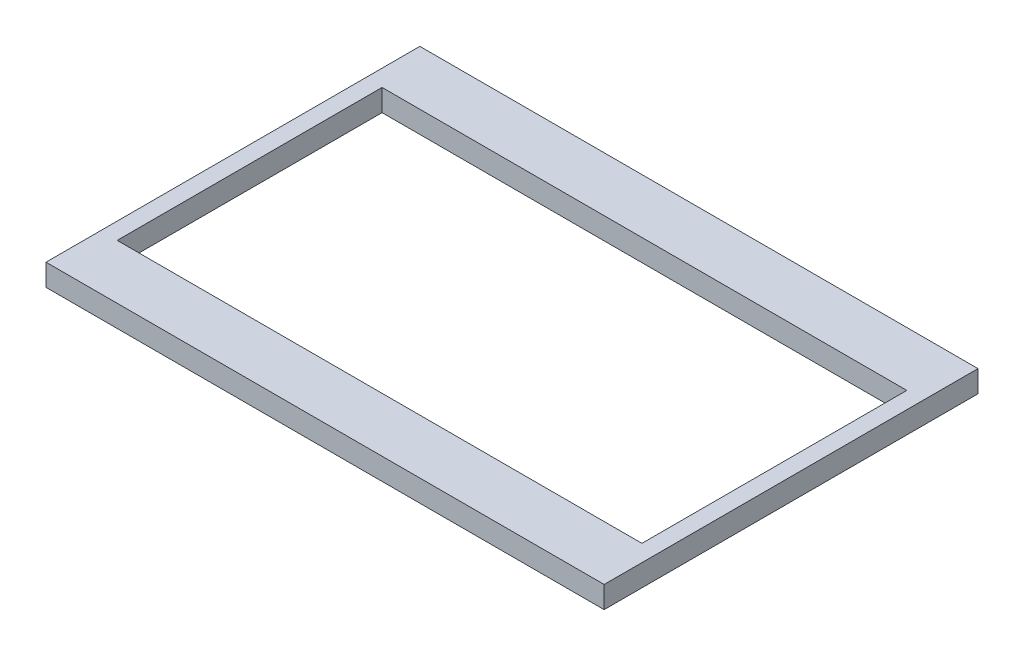
ISO-10303-21;
HEADER;
FILE_DESCRIPTION(('STEP AP214'),'2;1');
FILE_NAME('part.step','',(''),(''),'','','');
FILE_SCHEMA(('AUTOMOTIVE_DESIGN { 1 0 10303 214 1 1 1 1 }'));
ENDSEC;
DATA;
#1=APPLICATION_CONTEXT('core data for automotive mechanical design processes');
#2=APPLICATION_PROTOCOL_DEFINITION('international standard','automotive_design',2000,#1);
#3=PRODUCT_CONTEXT('',#1,'mechanical');
#4=PRODUCT('Part','Part','',(#3));
#5=PRODUCT_RELATED_PRODUCT_CATEGORY('part','',(#4));
#6=PRODUCT_DEFINITION_FORMATION('','',#4);
#7=PRODUCT_DEFINITION_CONTEXT('part definition',#1,'design');
#8=PRODUCT_DEFINITION('design','',#6,#7);
#9=PRODUCT_DEFINITION_SHAPE('','',#8);
#10=(LENGTH_UNIT() NAMED_UNIT(*) SI_UNIT(.MILLI.,.METRE.));
#11=(NAMED_UNIT(*) PLANE_ANGLE_UNIT() SI_UNIT($,.RADIAN.));
#12=(NAMED_UNIT(*) SI_UNIT($,.STERADIAN.) SOLID_ANGLE_UNIT());
#13=UNCERTAINTY_MEASURE_WITH_UNIT(LENGTH_MEASURE(1.E-05),#10,'distance_accuracy_value','');
#14=(GEOMETRIC_REPRESENTATION_CONTEXT(3) GLOBAL_UNCERTAINTY_ASSIGNED_CONTEXT((#13)) GLOBAL_UNIT_ASSIGNED_CONTEXT((#10,
#11,#12)) REPRESENTATION_CONTEXT('',''));
#15=CARTESIAN_POINT('',(0.,0.,0.));
#16=DIRECTION('',(0.,0.,1.));
#17=DIRECTION('',(1.,0.,0.));
#18=AXIS2_PLACEMENT_3D('',#15,#16,#17);
#19=CARTESIAN_POINT('',(-63.9,5.,42.8));
#20=DIRECTION('',(1.,0.,0.));
#21=DIRECTION('',(0.,0.,-1.));
#22=AXIS2_PLACEMENT_3D('',#19,#20,#21);
#23=PLANE('',#22);
#24=DIRECTION('',(0.,0.,1.));
#25=VECTOR('',#24,1.);
#26=CARTESIAN_POINT('',(-63.9,0.,42.8));
#27=LINE('',#26,#25);
#28=CARTESIAN_POINT('',(-63.9,0.,-42.8));
#29=VERTEX_POINT('',#28);
#30=CARTESIAN_POINT('',(-63.9,0.,42.8));
#31=VERTEX_POINT('',#30);
#32=EDGE_CURVE('E147',#29,#31,#27,.T.);
#33=ORIENTED_EDGE('',*,*,#32,.T.);
#34=DIRECTION('',(0.,-1.,0.));
#35=VECTOR('',#34,1.);
#36=CARTESIAN_POINT('',(-63.9,5.,42.8));
#37=LINE('',#36,#35);
#38=CARTESIAN_POINT('',(-63.9,5.,42.8));
#39=VERTEX_POINT('',#38);
#40=EDGE_CURVE('E11',#39,#31,#37,.T.);
#41=ORIENTED_EDGE('',*,*,#40,.F.);
#42=DIRECTION('',(0.,0.,1.));
#43=VECTOR('',#42,1.);
#44=CARTESIAN_POINT('',(-63.9,5.,42.8));
#45=LINE('',#44,#43);
#46=CARTESIAN_POINT('',(-63.9,5.,-42.8));
#47=VERTEX_POINT('',#46);
#48=EDGE_CURVE('E153',#47,#39,#45,.T.);
#49=ORIENTED_EDGE('',*,*,#48,.F.);
#50=DIRECTION('',(0.,-1.,0.));
#51=VECTOR('',#50,1.);
#52=CARTESIAN_POINT('',(-63.9,5.,-42.8));
#53=LINE('',#52,#51);
#54=EDGE_CURVE('E167',#47,#29,#53,.T.);
#55=ORIENTED_EDGE('',*,*,#54,.T.);
#56=EDGE_LOOP('',(#33,#41,#49,#55));
#57=FACE_BOUND('',#56,.T.);
#58=ADVANCED_FACE('F39',(#57),#23,.F.);
#59=CARTESIAN_POINT('',(63.9,5.,42.8));
#60=DIRECTION('',(0.,0.,-1.));
#61=DIRECTION('',(-1.,0.,0.));
#62=AXIS2_PLACEMENT_3D('',#59,#60,#61);
#63=PLANE('',#62);
#64=DIRECTION('',(1.,0.,0.));
#65=VECTOR('',#64,1.);
#66=CARTESIAN_POINT('',(63.9,0.,42.8));
#67=LINE('',#66,#65);
#68=CARTESIAN_POINT('',(63.9,0.,42.8));
#69=VERTEX_POINT('',#68);
#70=EDGE_CURVE('E171',#31,#69,#67,.T.);
#71=ORIENTED_EDGE('',*,*,#70,.T.);
#72=DIRECTION('',(0.,-1.,0.));
#73=VECTOR('',#72,1.);
#74=CARTESIAN_POINT('',(63.9,5.,42.8));
#75=LINE('',#74,#73);
#76=CARTESIAN_POINT('',(63.9,5.,42.8));
#77=VERTEX_POINT('',#76);
#78=EDGE_CURVE('E47',#77,#69,#75,.T.);
#79=ORIENTED_EDGE('',*,*,#78,.F.);
#80=DIRECTION('',(1.,0.,0.));
#81=VECTOR('',#80,1.);
#82=CARTESIAN_POINT('',(63.9,5.,42.8));
#83=LINE('',#82,#81);
#84=EDGE_CURVE('E157',#39,#77,#83,.T.);
#85=ORIENTED_EDGE('',*,*,#84,.F.);
#86=ORIENTED_EDGE('',*,*,#40,.T.);
#87=EDGE_LOOP('',(#71,#79,#85,#86));
#88=FACE_BOUND('',#87,.T.);
#89=ADVANCED_FACE('F205',(#88),#63,.F.);
#90=CARTESIAN_POINT('',(63.9,5.,42.8));
#91=DIRECTION('',(-1.,0.,0.));
#92=DIRECTION('',(0.,0.,1.));
#93=AXIS2_PLACEMENT_3D('',#90,#91,#92);
#94=PLANE('',#93);
#95=DIRECTION('',(0.,0.,-1.));
#96=VECTOR('',#95,1.);
#97=CARTESIAN_POINT('',(63.9,0.,42.8));
#98=LINE('',#97,#96);
#99=CARTESIAN_POINT('',(63.9,0.,-42.8));
#100=VERTEX_POINT('',#99);
#101=EDGE_CURVE('E174',#69,#100,#98,.T.);
#102=ORIENTED_EDGE('',*,*,#101,.T.);
#103=DIRECTION('',(0.,-1.,0.));
#104=VECTOR('',#103,1.);
#105=CARTESIAN_POINT('',(63.9,5.,-42.8));
#106=LINE('',#105,#104);
#107=CARTESIAN_POINT('',(63.9,5.,-42.8));
#108=VERTEX_POINT('',#107);
#109=EDGE_CURVE('E182',#108,#100,#106,.T.);
#110=ORIENTED_EDGE('',*,*,#109,.F.);
#111=DIRECTION('',(0.,0.,-1.));
#112=VECTOR('',#111,1.);
#113=CARTESIAN_POINT('',(63.9,5.,42.8));
#114=LINE('',#113,#112);
#115=EDGE_CURVE('E161',#77,#108,#114,.T.);
#116=ORIENTED_EDGE('',*,*,#115,.F.);
#117=ORIENTED_EDGE('',*,*,#78,.T.);
#118=EDGE_LOOP('',(#102,#110,#116,#117));
#119=FACE_BOUND('',#118,.T.);
#120=ADVANCED_FACE('F191',(#119),#94,.F.);
#121=CARTESIAN_POINT('',(63.9,5.,-42.8));
#122=DIRECTION('',(0.,0.,1.));
#123=DIRECTION('',(1.,0.,0.));
#124=AXIS2_PLACEMENT_3D('',#121,#122,#123);
#125=PLANE('',#124);
#126=DIRECTION('',(-1.,0.,0.));
#127=VECTOR('',#126,1.);
#128=CARTESIAN_POINT('',(63.9,0.,-42.8));
#129=LINE('',#128,#127);
#130=EDGE_CURVE('E158',#100,#29,#129,.T.);
#131=ORIENTED_EDGE('',*,*,#130,.T.);
#132=ORIENTED_EDGE('',*,*,#54,.F.);
#133=DIRECTION('',(-1.,0.,0.));
#134=VECTOR('',#133,1.);
#135=CARTESIAN_POINT('',(63.9,5.,-42.8));
#136=LINE('',#135,#134);
#137=EDGE_CURVE('E164',#108,#47,#136,.T.);
#138=ORIENTED_EDGE('',*,*,#137,.F.);
#139=ORIENTED_EDGE('',*,*,#109,.T.);
#140=EDGE_LOOP('',(#131,#132,#138,#139));
#141=FACE_BOUND('',#140,.T.);
#142=ADVANCED_FACE('F198',(#141),#125,.F.);
#143=CARTESIAN_POINT('',(0.,5.,0.));
#144=DIRECTION('',(0.,1.,0.));
#145=DIRECTION('',(0.,0.,1.));
#146=AXIS2_PLACEMENT_3D('',#143,#144,#145);
#147=PLANE('',#146);
#148=DIRECTION('',(0.,0.,1.));
#149=VECTOR('',#148,1.);
#150=CARTESIAN_POINT('',(-60.075,5.,30.325));
#151=LINE('',#150,#149);
#152=CARTESIAN_POINT('',(-60.075,5.,-30.325));
#153=VERTEX_POINT('',#152);
#154=CARTESIAN_POINT('',(-60.075,5.,30.325));
#155=VERTEX_POINT('',#154);
#156=EDGE_CURVE('E54',#153,#155,#151,.T.);
#157=ORIENTED_EDGE('',*,*,#156,.F.);
#158=DIRECTION('',(-1.,0.,0.));
#159=VECTOR('',#158,1.);
#160=CARTESIAN_POINT('',(60.075,5.,-30.325));
#161=LINE('',#160,#159);
#162=CARTESIAN_POINT('',(60.075,5.,-30.325));
#163=VERTEX_POINT('',#162);
#164=EDGE_CURVE('E125',#163,#153,#161,.T.);
#165=ORIENTED_EDGE('',*,*,#164,.F.);
#166=DIRECTION('',(0.,0.,-1.));
#167=VECTOR('',#166,1.);
#168=CARTESIAN_POINT('',(60.075,5.,30.325));
#169=LINE('',#168,#167);
#170=CARTESIAN_POINT('',(60.075,5.,30.325));
#171=VERTEX_POINT('',#170);
#172=EDGE_CURVE('E129',#171,#163,#169,.T.);
#173=ORIENTED_EDGE('',*,*,#172,.F.);
#174=DIRECTION('',(1.,0.,0.));
#175=VECTOR('',#174,1.);
#176=CARTESIAN_POINT('',(60.075,5.,30.325));
#177=LINE('',#176,#175);
#178=EDGE_CURVE('E138',#155,#171,#177,.T.);
#179=ORIENTED_EDGE('',*,*,#178,.F.);
#180=EDGE_LOOP('',(#157,#165,#173,#179));
#181=FACE_BOUND('',#180,.T.);
#182=ORIENTED_EDGE('',*,*,#48,.T.);
#183=ORIENTED_EDGE('',*,*,#84,.T.);
#184=ORIENTED_EDGE('',*,*,#115,.T.);
#185=ORIENTED_EDGE('',*,*,#137,.T.);
#186=EDGE_LOOP('',(#182,#183,#184,#185));
#187=FACE_BOUND('',#186,.T.);
#188=ADVANCED_FACE('F204',(#181,#187),#147,.T.);
#189=CARTESIAN_POINT('',(0.,0.,0.));
#190=DIRECTION('',(0.,1.,0.));
#191=DIRECTION('',(0.,0.,1.));
#192=AXIS2_PLACEMENT_3D('',#189,#190,#191);
#193=PLANE('',#192);
#194=DIRECTION('',(-1.,0.,0.));
#195=VECTOR('',#194,1.);
#196=CARTESIAN_POINT('',(60.075,0.,-30.325));
#197=LINE('',#196,#195);
#198=CARTESIAN_POINT('',(60.075,0.,-30.325));
#199=VERTEX_POINT('',#198);
#200=CARTESIAN_POINT('',(-60.075,0.,-30.325));
#201=VERTEX_POINT('',#200);
#202=EDGE_CURVE('E113',#199,#201,#197,.T.);
#203=ORIENTED_EDGE('',*,*,#202,.T.);
#204=DIRECTION('',(0.,0.,1.));
#205=VECTOR('',#204,1.);
#206=CARTESIAN_POINT('',(-60.075,0.,30.325));
#207=LINE('',#206,#205);
#208=CARTESIAN_POINT('',(-60.075,0.,30.325));
#209=VERTEX_POINT('',#208);
#210=EDGE_CURVE('E106',#201,#209,#207,.T.);
#211=ORIENTED_EDGE('',*,*,#210,.T.);
#212=DIRECTION('',(1.,0.,0.));
#213=VECTOR('',#212,1.);
#214=CARTESIAN_POINT('',(60.075,0.,30.325));
#215=LINE('',#214,#213);
#216=CARTESIAN_POINT('',(60.075,0.,30.325));
#217=VERTEX_POINT('',#216);
#218=EDGE_CURVE('E116',#209,#217,#215,.T.);
#219=ORIENTED_EDGE('',*,*,#218,.T.);
#220=DIRECTION('',(0.,0.,-1.));
#221=VECTOR('',#220,1.);
#222=CARTESIAN_POINT('',(60.075,0.,30.325));
#223=LINE('',#222,#221);
#224=EDGE_CURVE('E62',#217,#199,#223,.T.);
#225=ORIENTED_EDGE('',*,*,#224,.T.);
#226=EDGE_LOOP('',(#203,#211,#219,#225));
#227=FACE_BOUND('',#226,.T.);
#228=ORIENTED_EDGE('',*,*,#32,.F.);
#229=ORIENTED_EDGE('',*,*,#130,.F.);
#230=ORIENTED_EDGE('',*,*,#101,.F.);
#231=ORIENTED_EDGE('',*,*,#70,.F.);
#232=EDGE_LOOP('',(#228,#229,#230,#231));
#233=FACE_BOUND('',#232,.T.);
#234=ADVANCED_FACE('F121',(#227,#233),#193,.F.);
#235=CARTESIAN_POINT('',(-60.075,0.,30.325));
#236=DIRECTION('',(-1.,0.,0.));
#237=DIRECTION('',(0.,0.,1.));
#238=AXIS2_PLACEMENT_3D('',#235,#236,#237);
#239=PLANE('',#238);
#240=ORIENTED_EDGE('',*,*,#156,.T.);
#241=DIRECTION('',(0.,1.,0.));
#242=VECTOR('',#241,1.);
#243=CARTESIAN_POINT('',(-60.075,0.,30.325));
#244=LINE('',#243,#242);
#245=EDGE_CURVE('E102',#209,#155,#244,.T.);
#246=ORIENTED_EDGE('',*,*,#245,.F.);
#247=ORIENTED_EDGE('',*,*,#210,.F.);
#248=DIRECTION('',(0.,1.,0.));
#249=VECTOR('',#248,1.);
#250=CARTESIAN_POINT('',(-60.075,0.,-30.325));
#251=LINE('',#250,#249);
#252=EDGE_CURVE('E144',#201,#153,#251,.T.);
#253=ORIENTED_EDGE('',*,*,#252,.T.);
#254=EDGE_LOOP('',(#240,#246,#247,#253));
#255=FACE_BOUND('',#254,.T.);
#256=ADVANCED_FACE('F104',(#255),#239,.F.);
#257=CARTESIAN_POINT('',(60.075,0.,-30.325));
#258=DIRECTION('',(0.,0.,-1.));
#259=DIRECTION('',(-1.,0.,0.));
#260=AXIS2_PLACEMENT_3D('',#257,#258,#259);
#261=PLANE('',#260);
#262=ORIENTED_EDGE('',*,*,#164,.T.);
#263=ORIENTED_EDGE('',*,*,#252,.F.);
#264=ORIENTED_EDGE('',*,*,#202,.F.);
#265=DIRECTION('',(0.,1.,0.));
#266=VECTOR('',#265,1.);
#267=CARTESIAN_POINT('',(60.075,0.,-30.325));
#268=LINE('',#267,#266);
#269=EDGE_CURVE('E148',#199,#163,#268,.T.);
#270=ORIENTED_EDGE('',*,*,#269,.T.);
#271=EDGE_LOOP('',(#262,#263,#264,#270));
#272=FACE_BOUND('',#271,.T.);
#273=ADVANCED_FACE('F222',(#272),#261,.F.);
#274=CARTESIAN_POINT('',(60.075,0.,30.325));
#275=DIRECTION('',(1.,0.,0.));
#276=DIRECTION('',(0.,0.,-1.));
#277=AXIS2_PLACEMENT_3D('',#274,#275,#276);
#278=PLANE('',#277);
#279=ORIENTED_EDGE('',*,*,#172,.T.);
#280=ORIENTED_EDGE('',*,*,#269,.F.);
#281=ORIENTED_EDGE('',*,*,#224,.F.);
#282=DIRECTION('',(0.,1.,0.));
#283=VECTOR('',#282,1.);
#284=CARTESIAN_POINT('',(60.075,0.,30.325));
#285=LINE('',#284,#283);
#286=EDGE_CURVE('E112',#217,#171,#285,.T.);
#287=ORIENTED_EDGE('',*,*,#286,.T.);
#288=EDGE_LOOP('',(#279,#280,#281,#287));
#289=FACE_BOUND('',#288,.T.);
#290=ADVANCED_FACE('F225',(#289),#278,.F.);
#291=CARTESIAN_POINT('',(60.075,0.,30.325));
#292=DIRECTION('',(0.,0.,1.));
#293=DIRECTION('',(1.,0.,0.));
#294=AXIS2_PLACEMENT_3D('',#291,#292,#293);
#295=PLANE('',#294);
#296=ORIENTED_EDGE('',*,*,#178,.T.);
#297=ORIENTED_EDGE('',*,*,#286,.F.);
#298=ORIENTED_EDGE('',*,*,#218,.F.);
#299=ORIENTED_EDGE('',*,*,#245,.T.);
#300=EDGE_LOOP('',(#296,#297,#298,#299));
#301=FACE_BOUND('',#300,.T.);
#302=ADVANCED_FACE('F117',(#301),#295,.F.);
#303=CLOSED_SHELL('',(#58,#89,#120,#142,#188,#234,#256,#273,#290,#302));
#304=MANIFOLD_SOLID_BREP('B2',#303);
#305=ADVANCED_BREP_SHAPE_REPRESENTATION('',(#18,#304),#14);
#306=SHAPE_DEFINITION_REPRESENTATION(#9,#305);
ENDSEC;
END-ISO-10303-21;
